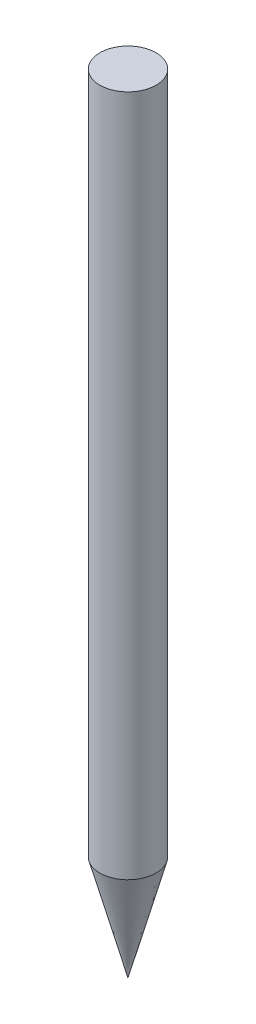
ISO-10303-21;
HEADER;
FILE_DESCRIPTION(('STEP AP214'),'2;1');
FILE_NAME('part.step','',(''),(''),'','','');
FILE_SCHEMA(('AUTOMOTIVE_DESIGN { 1 0 10303 214 1 1 1 1 }'));
ENDSEC;
DATA;
#1=APPLICATION_CONTEXT('core data for automotive mechanical design processes');
#2=APPLICATION_PROTOCOL_DEFINITION('international standard','automotive_design',2000,#1);
#3=PRODUCT_CONTEXT('',#1,'mechanical');
#4=PRODUCT('Part','Part','',(#3));
#5=PRODUCT_RELATED_PRODUCT_CATEGORY('part','',(#4));
#6=PRODUCT_DEFINITION_FORMATION('','',#4);
#7=PRODUCT_DEFINITION_CONTEXT('part definition',#1,'design');
#8=PRODUCT_DEFINITION('design','',#6,#7);
#9=PRODUCT_DEFINITION_SHAPE('','',#8);
#10=(LENGTH_UNIT() NAMED_UNIT(*) SI_UNIT(.MILLI.,.METRE.));
#11=(NAMED_UNIT(*) PLANE_ANGLE_UNIT() SI_UNIT($,.RADIAN.));
#12=(NAMED_UNIT(*) SI_UNIT($,.STERADIAN.) SOLID_ANGLE_UNIT());
#13=UNCERTAINTY_MEASURE_WITH_UNIT(LENGTH_MEASURE(1.E-05),#10,'distance_accuracy_value','');
#14=(GEOMETRIC_REPRESENTATION_CONTEXT(3) GLOBAL_UNCERTAINTY_ASSIGNED_CONTEXT((#13)) GLOBAL_UNIT_ASSIGNED_CONTEXT((#10,
#11,#12)) REPRESENTATION_CONTEXT('',''));
#15=CARTESIAN_POINT('',(0.,0.,0.));
#16=DIRECTION('',(0.,0.,1.));
#17=DIRECTION('',(1.,0.,0.));
#18=AXIS2_PLACEMENT_3D('',#15,#16,#17);
#19=CARTESIAN_POINT('',(0.,140.,0.));
#20=DIRECTION('',(0.,-1.,0.));
#21=DIRECTION('',(0.,0.,-1.));
#22=AXIS2_PLACEMENT_3D('',#19,#20,#21);
#23=CYLINDRICAL_SURFACE('',#22,5.);
#24=CARTESIAN_POINT('',(0.,18.6602540378443,0.));
#25=DIRECTION('',(0.,1.,0.));
#26=DIRECTION('',(0.,0.,1.));
#27=AXIS2_PLACEMENT_3D('',#24,#25,#26);
#28=CIRCLE('',#27,5.);
#29=CARTESIAN_POINT('',(0.,18.6602540378443,5.));
#30=VERTEX_POINT('',#29);
#31=EDGE_CURVE('E11',#30,#30,#28,.T.);
#32=ORIENTED_EDGE('',*,*,#31,.T.);
#33=EDGE_LOOP('',(#32));
#34=FACE_BOUND('',#33,.T.);
#35=CARTESIAN_POINT('',(0.,140.,0.));
#36=DIRECTION('',(0.,1.,0.));
#37=DIRECTION('',(0.,0.,1.));
#38=AXIS2_PLACEMENT_3D('',#35,#36,#37);
#39=CIRCLE('',#38,5.);
#40=CARTESIAN_POINT('',(0.,140.,5.));
#41=VERTEX_POINT('',#40);
#42=EDGE_CURVE('E41',#41,#41,#39,.T.);
#43=ORIENTED_EDGE('',*,*,#42,.F.);
#44=EDGE_LOOP('',(#43));
#45=FACE_BOUND('',#44,.T.);
#46=ADVANCED_FACE('F34',(#34,#45),#23,.T.);
#47=CARTESIAN_POINT('',(0.,140.,0.));
#48=DIRECTION('',(0.,1.,0.));
#49=DIRECTION('',(0.,0.,1.));
#50=AXIS2_PLACEMENT_3D('',#47,#48,#49);
#51=PLANE('',#50);
#52=ORIENTED_EDGE('',*,*,#42,.T.);
#53=EDGE_LOOP('',(#52));
#54=FACE_BOUND('',#53,.T.);
#55=ADVANCED_FACE('F46',(#54),#51,.T.);
#56=CARTESIAN_POINT('',(0.,18.6602540378443,0.));
#57=DIRECTION('',(0.,1.,0.));
#58=DIRECTION('',(0.,0.,1.));
#59=AXIS2_PLACEMENT_3D('',#56,#57,#58);
#60=CONICAL_SURFACE('',#59,5.,0.26179938779915);
#61=CARTESIAN_POINT('',(0.,0.,0.));
#62=VERTEX_POINT('',#61);
#63=VERTEX_LOOP('',#62);
#64=FACE_BOUND('',#63,.T.);
#65=ORIENTED_EDGE('',*,*,#31,.F.);
#66=EDGE_LOOP('',(#65));
#67=FACE_BOUND('',#66,.T.);
#68=ADVANCED_FACE('F36',(#64,#67),#60,.T.);
#69=CLOSED_SHELL('',(#46,#55,#68));
#70=MANIFOLD_SOLID_BREP('B2',#69);
#71=ADVANCED_BREP_SHAPE_REPRESENTATION('',(#18,#70),#14);
#72=SHAPE_DEFINITION_REPRESENTATION(#9,#71);
ENDSEC;
END-ISO-10303-21;
